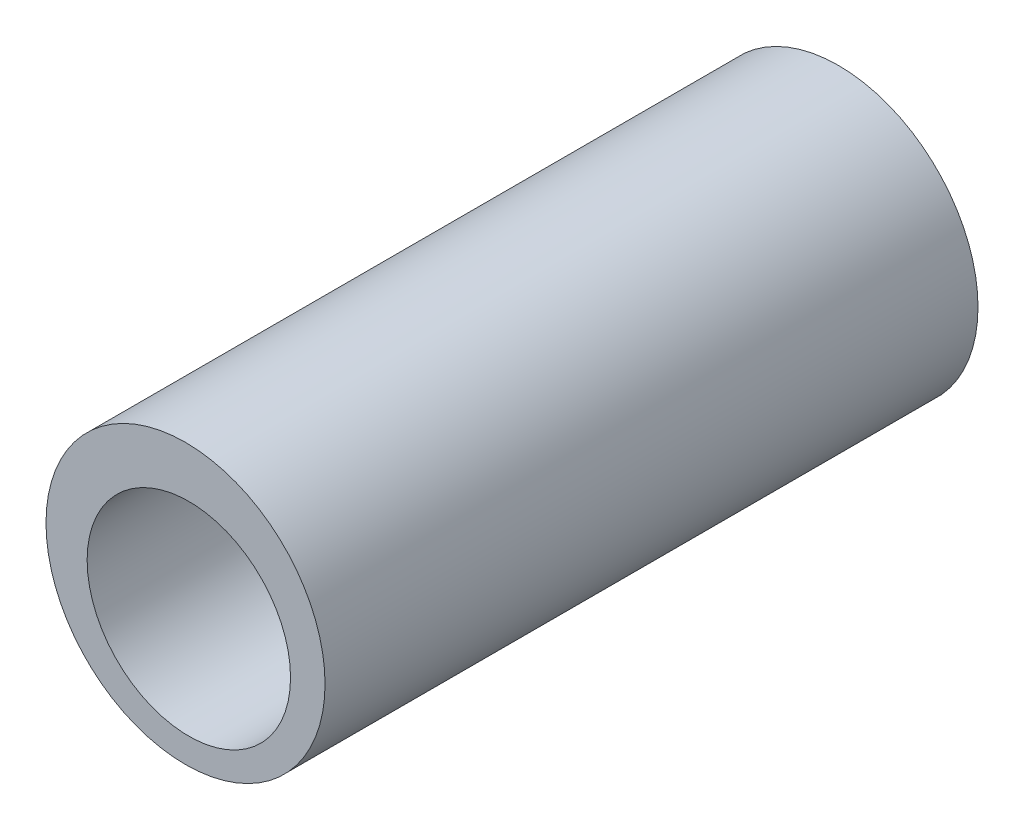
ISO-10303-21;
HEADER;
FILE_DESCRIPTION(('STEP AP214'),'2;1');
FILE_NAME('part.step','',(''),(''),'','','');
FILE_SCHEMA(('AUTOMOTIVE_DESIGN { 1 0 10303 214 1 1 1 1 }'));
ENDSEC;
DATA;
#1=APPLICATION_CONTEXT('core data for automotive mechanical design processes');
#2=APPLICATION_PROTOCOL_DEFINITION('international standard','automotive_design',2000,#1);
#3=PRODUCT_CONTEXT('',#1,'mechanical');
#4=PRODUCT('Part','Part','',(#3));
#5=PRODUCT_RELATED_PRODUCT_CATEGORY('part','',(#4));
#6=PRODUCT_DEFINITION_FORMATION('','',#4);
#7=PRODUCT_DEFINITION_CONTEXT('part definition',#1,'design');
#8=PRODUCT_DEFINITION('design','',#6,#7);
#9=PRODUCT_DEFINITION_SHAPE('','',#8);
#10=(LENGTH_UNIT() NAMED_UNIT(*) SI_UNIT(.MILLI.,.METRE.));
#11=(NAMED_UNIT(*) PLANE_ANGLE_UNIT() SI_UNIT($,.RADIAN.));
#12=(NAMED_UNIT(*) SI_UNIT($,.STERADIAN.) SOLID_ANGLE_UNIT());
#13=UNCERTAINTY_MEASURE_WITH_UNIT(LENGTH_MEASURE(1.E-05),#10,'distance_accuracy_value','');
#14=(GEOMETRIC_REPRESENTATION_CONTEXT(3) GLOBAL_UNCERTAINTY_ASSIGNED_CONTEXT((#13)) GLOBAL_UNIT_ASSIGNED_CONTEXT((#10,
#11,#12)) REPRESENTATION_CONTEXT('',''));
#15=CARTESIAN_POINT('',(0.,0.,0.));
#16=DIRECTION('',(0.,0.,1.));
#17=DIRECTION('',(1.,0.,0.));
#18=AXIS2_PLACEMENT_3D('',#15,#16,#17);
#19=CARTESIAN_POINT('',(-0.90411454893035,3.1644009212563,178.308));
#20=DIRECTION('',(0.,0.,-1.));
#21=DIRECTION('',(-1.,0.,0.));
#22=AXIS2_PLACEMENT_3D('',#19,#20,#21);
#23=CYLINDRICAL_SURFACE('',#22,38.1);
#24=CARTESIAN_POINT('',(-0.90411454893035,3.1644009212563,178.308));
#25=DIRECTION('',(0.,0.,1.));
#26=DIRECTION('',(1.,0.,0.));
#27=AXIS2_PLACEMENT_3D('',#24,#25,#26);
#28=CIRCLE('',#27,38.1);
#29=CARTESIAN_POINT('',(37.1958854510696,3.1644009212563,178.308));
#30=VERTEX_POINT('',#29);
#31=EDGE_CURVE('E10',#30,#30,#28,.T.);
#32=ORIENTED_EDGE('',*,*,#31,.F.);
#33=EDGE_LOOP('',(#32));
#34=FACE_BOUND('',#33,.T.);
#35=CARTESIAN_POINT('',(-0.90411454893035,3.1644009212563,0.));
#36=DIRECTION('',(0.,0.,1.));
#37=DIRECTION('',(1.,0.,0.));
#38=AXIS2_PLACEMENT_3D('',#35,#36,#37);
#39=CIRCLE('',#38,38.1);
#40=CARTESIAN_POINT('',(37.1958854510696,3.1644009212563,0.));
#41=VERTEX_POINT('',#40);
#42=EDGE_CURVE('E34',#41,#41,#39,.T.);
#43=ORIENTED_EDGE('',*,*,#42,.T.);
#44=EDGE_LOOP('',(#43));
#45=FACE_BOUND('',#44,.T.);
#46=ADVANCED_FACE('F31',(#34,#45),#23,.T.);
#47=CARTESIAN_POINT('',(-0.90411454893035,3.1644009212563,178.308));
#48=DIRECTION('',(0.,0.,1.));
#49=DIRECTION('',(1.,0.,0.));
#50=AXIS2_PLACEMENT_3D('',#47,#48,#49);
#51=PLANE('',#50);
#52=CARTESIAN_POINT('',(0.,0.,178.308));
#53=DIRECTION('',(0.,0.,1.));
#54=DIRECTION('',(1.,0.,0.));
#55=AXIS2_PLACEMENT_3D('',#52,#53,#54);
#56=CIRCLE('',#55,27.7722400880127);
#57=CARTESIAN_POINT('',(27.7722400880127,0.,178.308));
#58=VERTEX_POINT('',#57);
#59=EDGE_CURVE('E43',#58,#58,#56,.T.);
#60=ORIENTED_EDGE('',*,*,#59,.F.);
#61=EDGE_LOOP('',(#60));
#62=FACE_BOUND('',#61,.T.);
#63=ORIENTED_EDGE('',*,*,#31,.T.);
#64=EDGE_LOOP('',(#63));
#65=FACE_BOUND('',#64,.T.);
#66=ADVANCED_FACE('F58',(#62,#65),#51,.T.);
#67=CARTESIAN_POINT('',(-0.90411454893035,3.1644009212563,0.));
#68=DIRECTION('',(0.,0.,1.));
#69=DIRECTION('',(1.,0.,0.));
#70=AXIS2_PLACEMENT_3D('',#67,#68,#69);
#71=PLANE('',#70);
#72=CARTESIAN_POINT('',(0.,0.,0.));
#73=DIRECTION('',(0.,0.,1.));
#74=DIRECTION('',(1.,0.,0.));
#75=AXIS2_PLACEMENT_3D('',#72,#73,#74);
#76=CIRCLE('',#75,27.7722400880127);
#77=CARTESIAN_POINT('',(27.7722400880127,0.,0.));
#78=VERTEX_POINT('',#77);
#79=EDGE_CURVE('E41',#78,#78,#76,.T.);
#80=ORIENTED_EDGE('',*,*,#79,.T.);
#81=EDGE_LOOP('',(#80));
#82=FACE_BOUND('',#81,.T.);
#83=ORIENTED_EDGE('',*,*,#42,.F.);
#84=EDGE_LOOP('',(#83));
#85=FACE_BOUND('',#84,.T.);
#86=ADVANCED_FACE('F49',(#82,#85),#71,.F.);
#87=CARTESIAN_POINT('',(0.,0.,0.));
#88=DIRECTION('',(0.,0.,1.));
#89=DIRECTION('',(1.,0.,0.));
#90=AXIS2_PLACEMENT_3D('',#87,#88,#89);
#91=CYLINDRICAL_SURFACE('',#90,27.7722400880127);
#92=ORIENTED_EDGE('',*,*,#79,.F.);
#93=EDGE_LOOP('',(#92));
#94=FACE_BOUND('',#93,.T.);
#95=ORIENTED_EDGE('',*,*,#59,.T.);
#96=EDGE_LOOP('',(#95));
#97=FACE_BOUND('',#96,.T.);
#98=ADVANCED_FACE('F52',(#94,#97),#91,.F.);
#99=CLOSED_SHELL('',(#46,#66,#86,#98));
#100=MANIFOLD_SOLID_BREP('B2',#99);
#101=ADVANCED_BREP_SHAPE_REPRESENTATION('',(#18,#100),#14);
#102=SHAPE_DEFINITION_REPRESENTATION(#9,#101);
ENDSEC;
END-ISO-10303-21;
